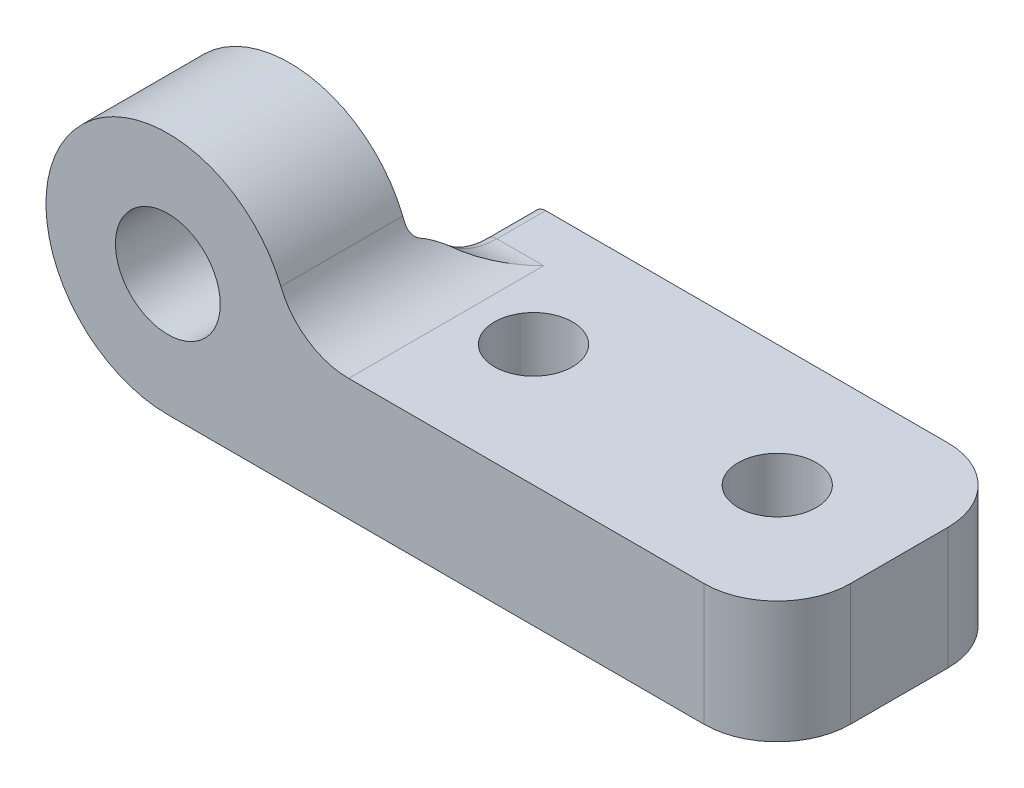
ISO-10303-21;
HEADER;
FILE_DESCRIPTION(('STEP AP214'),'2;1');
FILE_NAME('part.step','',(''),(''),'','','');
FILE_SCHEMA(('AUTOMOTIVE_DESIGN { 1 0 10303 214 1 1 1 1 }'));
ENDSEC;
DATA;
#1=APPLICATION_CONTEXT('core data for automotive mechanical design processes');
#2=APPLICATION_PROTOCOL_DEFINITION('international standard','automotive_design',2000,#1);
#3=PRODUCT_CONTEXT('',#1,'mechanical');
#4=PRODUCT('Part','Part','',(#3));
#5=PRODUCT_RELATED_PRODUCT_CATEGORY('part','',(#4));
#6=PRODUCT_DEFINITION_FORMATION('','',#4);
#7=PRODUCT_DEFINITION_CONTEXT('part definition',#1,'design');
#8=PRODUCT_DEFINITION('design','',#6,#7);
#9=PRODUCT_DEFINITION_SHAPE('','',#8);
#10=(LENGTH_UNIT() NAMED_UNIT(*) SI_UNIT(.MILLI.,.METRE.));
#11=(NAMED_UNIT(*) PLANE_ANGLE_UNIT() SI_UNIT($,.RADIAN.));
#12=(NAMED_UNIT(*) SI_UNIT($,.STERADIAN.) SOLID_ANGLE_UNIT());
#13=UNCERTAINTY_MEASURE_WITH_UNIT(LENGTH_MEASURE(1.E-05),#10,'distance_accuracy_value','');
#14=(GEOMETRIC_REPRESENTATION_CONTEXT(3) GLOBAL_UNCERTAINTY_ASSIGNED_CONTEXT((#13)) GLOBAL_UNIT_ASSIGNED_CONTEXT((#10,
#11,#12)) REPRESENTATION_CONTEXT('',''));
#15=CARTESIAN_POINT('',(0.,0.,0.));
#16=DIRECTION('',(0.,0.,1.));
#17=DIRECTION('',(1.,0.,0.));
#18=AXIS2_PLACEMENT_3D('',#15,#16,#17);
#19=CARTESIAN_POINT('',(0.,0.,5.));
#20=DIRECTION('',(0.,0.,1.));
#21=DIRECTION('',(1.,0.,0.));
#22=AXIS2_PLACEMENT_3D('',#19,#20,#21);
#23=PLANE('',#22);
#24=CARTESIAN_POINT('',(0.,0.,5.));
#25=DIRECTION('',(0.,0.,1.));
#26=DIRECTION('',(1.,0.,0.));
#27=AXIS2_PLACEMENT_3D('',#24,#25,#26);
#28=CIRCLE('',#27,2.15);
#29=CARTESIAN_POINT('',(2.15,0.,5.));
#30=VERTEX_POINT('',#29);
#31=EDGE_CURVE('E170',#30,#30,#28,.T.);
#32=ORIENTED_EDGE('',*,*,#31,.F.);
#33=EDGE_LOOP('',(#32));
#34=FACE_BOUND('',#33,.T.);
#35=DIRECTION('',(1.,0.,0.));
#36=VECTOR('',#35,1.);
#37=CARTESIAN_POINT('',(0.,-5.,5.));
#38=LINE('',#37,#36);
#39=CARTESIAN_POINT('',(0.,-5.,5.));
#40=VERTEX_POINT('',#39);
#41=CARTESIAN_POINT('',(22.,-5.,5.));
#42=VERTEX_POINT('',#41);
#43=EDGE_CURVE('E174',#40,#42,#38,.T.);
#44=ORIENTED_EDGE('',*,*,#43,.T.);
#45=DIRECTION('',(0.,-1.,0.));
#46=VECTOR('',#45,1.);
#47=CARTESIAN_POINT('',(22.,0.,5.));
#48=LINE('',#47,#46);
#49=CARTESIAN_POINT('',(22.,0.,5.));
#50=VERTEX_POINT('',#49);
#51=EDGE_CURVE('E62',#42,#50,#48,.F.);
#52=ORIENTED_EDGE('',*,*,#51,.T.);
#53=DIRECTION('',(1.,0.,0.));
#54=VECTOR('',#53,1.);
#55=CARTESIAN_POINT('',(0.,0.,5.));
#56=LINE('',#55,#54);
#57=CARTESIAN_POINT('',(7.41619848709566,0.,5.));
#58=VERTEX_POINT('',#57);
#59=EDGE_CURVE('E184',#58,#50,#56,.T.);
#60=ORIENTED_EDGE('',*,*,#59,.F.);
#61=CARTESIAN_POINT('',(7.41619848709566,3.,5.));
#62=DIRECTION('',(0.,0.,1.));
#63=DIRECTION('',(1.,0.,0.));
#64=AXIS2_PLACEMENT_3D('',#61,#62,#63);
#65=CIRCLE('',#64,3.);
#66=CARTESIAN_POINT('',(4.63512405443479,1.875,5.));
#67=VERTEX_POINT('',#66);
#68=EDGE_CURVE('E195',#58,#67,#65,.F.);
#69=ORIENTED_EDGE('',*,*,#68,.T.);
#70=CARTESIAN_POINT('',(0.,0.,5.));
#71=DIRECTION('',(0.,0.,1.));
#72=DIRECTION('',(1.,0.,0.));
#73=AXIS2_PLACEMENT_3D('',#70,#71,#72);
#74=CIRCLE('',#73,5.);
#75=EDGE_CURVE('E169',#67,#40,#74,.T.);
#76=ORIENTED_EDGE('',*,*,#75,.T.);
#77=EDGE_LOOP('',(#44,#52,#60,#69,#76));
#78=FACE_BOUND('',#77,.T.);
#79=ADVANCED_FACE('F39',(#34,#78),#23,.T.);
#80=CARTESIAN_POINT('',(0.,0.,0.));
#81=DIRECTION('',(0.,0.,1.));
#82=DIRECTION('',(1.,0.,0.));
#83=AXIS2_PLACEMENT_3D('',#80,#81,#82);
#84=PLANE('',#83);
#85=CARTESIAN_POINT('',(7.41619848709566,3.,0.));
#86=DIRECTION('',(0.,0.,1.));
#87=DIRECTION('',(1.,0.,0.));
#88=AXIS2_PLACEMENT_3D('',#85,#86,#87);
#89=CIRCLE('',#88,3.);
#90=CARTESIAN_POINT('',(4.63512405443479,1.875,0.));
#91=VERTEX_POINT('',#90);
#92=CARTESIAN_POINT('',(4.74291936944649,1.63853800672187,0.));
#93=VERTEX_POINT('',#92);
#94=EDGE_CURVE('E193',#91,#93,#89,.T.);
#95=ORIENTED_EDGE('',*,*,#94,.T.);
#96=CARTESIAN_POINT('',(5.03478250618408,0.190284366446676,-0.618473127065329));
#97=CARTESIAN_POINT('',(5.17924355248974,0.233687536650278,0.));
#98=CARTESIAN_POINT('',(4.56956501236816,0.0505102572168218,0.));
#99=CARTESIAN_POINT('',(5.02257175089872,0.246379258458411,-0.600326381471568));
#100=CARTESIAN_POINT('',(5.14248850087224,0.272052467553295,0.));
#101=CARTESIAN_POINT('',(4.54514350140173,0.131926460099157,0.));
#102=CARTESIAN_POINT('',(5.0138538586825,0.304814689622035,-0.581174993979142));
#103=CARTESIAN_POINT('',(5.10782921733972,0.319464736814677,0.));
#104=CARTESIAN_POINT('',(4.52770771694514,0.215070111300229,0.));
#105=CARTESIAN_POINT('',(5.00259462089896,0.42515232100956,-0.541513315134813));
#106=CARTESIAN_POINT('',(5.04752693229299,0.426619381448087,0.));
#107=CARTESIAN_POINT('',(4.50518924155133,0.38232986351428,0.));
#108=CARTESIAN_POINT('',(5.0000006567291,0.487020277447617,-0.521016167447404));
#109=CARTESIAN_POINT('',(5.02145993490053,0.485666949690905,0.));
#110=CARTESIAN_POINT('',(4.50000131340713,0.466431394269014,0.));
#111=CARTESIAN_POINT('',(4.9999989581471,0.651232487158578,-0.466659380616803));
#112=CARTESIAN_POINT('',(4.96774620965812,0.647968262364999,0.));
#113=CARTESIAN_POINT('',(4.49999791637522,0.683895251161616,0.));
#114=CARTESIAN_POINT('',(5.0065246259501,0.75603694629194,-0.432012517621331));
#115=CARTESIAN_POINT('',(4.94575651634707,0.75898544947662,0.));
#116=CARTESIAN_POINT('',(4.51304925169868,0.817223195875755,0.));
#117=CARTESIAN_POINT('',(5.02959105704785,0.973006744058944,-0.36209086247517));
#118=CARTESIAN_POINT('',(4.92634677959586,0.992139139228018,0.));
#119=CARTESIAN_POINT('',(4.55918211392582,1.08073967425488,0.));
#120=CARTESIAN_POINT('',(5.04618480400655,1.08520820603648,-0.326813713253743));
#121=CARTESIAN_POINT('',(4.92764947028998,1.11426844665437,0.));
#122=CARTESIAN_POINT('',(4.59236960816057,1.21090778404174,0.));
#123=CARTESIAN_POINT('',(5.09007022801355,1.33475606872088,-0.252663773424171));
#124=CARTESIAN_POINT('',(4.9522449434099,1.38090818453704,0.));
#125=CARTESIAN_POINT('',(4.68014045585593,1.48681425086296,0.));
#126=CARTESIAN_POINT('',(5.11864922841737,1.47325239361425,-0.214119424530078));
#127=CARTESIAN_POINT('',(4.97788581721399,1.52790190919719,0.));
#128=CARTESIAN_POINT('',(4.73729845586683,1.63170934224265,0.));
#129=CARTESIAN_POINT('',(5.18261429560836,1.75882923292263,-0.14362154746534));
#130=CARTESIAN_POINT('',(5.04859606392434,1.82110509321211,0.));
#131=CARTESIAN_POINT('',(4.86522859020357,1.91544478185198,0.));
#132=CARTESIAN_POINT('',(5.21801294800704,1.90592526289275,-0.111680435026558));
#133=CARTESIAN_POINT('',(5.09327366657072,1.96890779920535,0.));
#134=CARTESIAN_POINT('',(4.93602589575534,2.05427334401096,0.));
#135=CARTESIAN_POINT('',(5.29306008732954,2.20722328665073,-0.0583799571947826));
#136=CARTESIAN_POINT('',(5.19457888326569,2.26179791760295,0.));
#137=CARTESIAN_POINT('',(5.08612017491822,2.32748395615759,0.));
#138=CARTESIAN_POINT('',(5.33271637963534,2.36143802551267,-0.037040444524281));
#139=CARTESIAN_POINT('',(5.25153079383402,2.40881518356096,0.));
#140=CARTESIAN_POINT('',(5.16543275929145,2.46185722743059,0.));
#141=CARTESIAN_POINT('',(5.41401865001419,2.67370467487119,-0.00801623075713629));
#142=CARTESIAN_POINT('',(5.37060624432504,2.69974739914806,0.));
#143=CARTESIAN_POINT('',(5.32803729991853,2.72801138084455,0.));
#144=CARTESIAN_POINT('',(5.45566348076545,2.83175434745127,-0.000323751230628065));
#145=CARTESIAN_POINT('',(5.43348646360943,2.84575093606398,0.));
#146=CARTESIAN_POINT('',(5.41132696152862,2.8597936973689,0.));
#147=CARTESIAN_POINT('',(5.49821825923777,2.99323876029808,-3.29128078525582E-06));
#148=CARTESIAN_POINT('',(5.49732737620623,2.99380218933209,0.));
#149=CARTESIAN_POINT('',(5.49643651847559,2.9943656388517,0.));
#150=CARTESIAN_POINT('',(5.49910913007641,2.99661937709075,4.38688642673777E-08));
#151=CARTESIAN_POINT('',(5.49866368657529,2.99690109845423,0.));
#152=CARTESIAN_POINT('',(5.49821826015288,2.99718281971953,0.));
#153=CARTESIAN_POINT('',(5.5,3.,0.));
#154=CARTESIAN_POINT('',(5.5,3.,0.));
#155=CARTESIAN_POINT('',(5.5,3.,0.));
#156=(BOUNDED_SURFACE() B_SPLINE_SURFACE(3,2,((#96,#97,#98),(#99,#100,#101),(#102,#103,#104),
(#105,#106,#107),(#108,#109,#110),(#111,#112,#113),(#114,#115,#116),(#117,#118,#119),(#120,#121,
#122),(#123,#124,#125),(#126,#127,#128),(#129,#130,#131),(#132,#133,#134),(#135,#136,#137),
(#138,#139,#140),(#141,#142,#143),(#144,#145,#146),(#147,#148,#149),(#150,#151,#152),(#153,#154,
#155)),.UNSPECIFIED.,.F.,.F.,.F.) B_SPLINE_SURFACE_WITH_KNOTS((4,2,2,2,2,2,2,2,2,4),(3,3),(0.,
0.254174347496883,0.506156676722879,0.905908294187887,1.30778209054064,1.77398960052862,
2.2410658803955,2.70901354847842,3.17669441359253,3.18669441359307),(0.,1.),
.UNSPECIFIED.) GEOMETRIC_REPRESENTATION_ITEM() RATIONAL_B_SPLINE_SURFACE(((1.,0.617678616219367,
1.),(1.,0.632385474459163,1.),(1.,0.647345517953677,1.),(1.,0.67727649991279,1.),(1.,
0.692246231770443,1.),(1.,0.730681960778521,1.),(1.,0.753982355327923,1.),(1.,0.79901258307502,
1.),(1.,0.820733421895581,1.),(1.,0.864809657092309,1.),(1.,0.886709996156685,1.),(1.,
0.925613944869766,1.),(1.,0.942608353494843,1.),(1.,0.970472728603621,1.),(1.,0.981331210037782,
1.),(1.,0.996012120267791,1.),(1.,0.999838557178386,1.),(1.,0.999998345092795,1.),(1.,
1.00000001226919,1.),(1.,1.,1.))) REPRESENTATION_ITEM('') SURFACE());
#157=CARTESIAN_POINT('',(5.5,3.,0.));
#158=CARTESIAN_POINT('',(5.49821826015288,2.99718281971953,0.));
#159=CARTESIAN_POINT('',(5.49643651847559,2.9943656388517,0.));
#160=CARTESIAN_POINT('',(5.41132696152863,2.8597936973689,0.));
#161=CARTESIAN_POINT('',(5.32803729991853,2.72801138084455,0.));
#162=CARTESIAN_POINT('',(5.16543275929145,2.46185722743059,0.));
#163=CARTESIAN_POINT('',(5.08612017491822,2.32748395615759,0.));
#164=CARTESIAN_POINT('',(4.93602589575534,2.05427334401096,0.));
#165=CARTESIAN_POINT('',(4.86522859020357,1.91544478185198,0.));
#166=CARTESIAN_POINT('',(4.73729845586683,1.63170934224265,0.));
#167=CARTESIAN_POINT('',(4.68014045585593,1.48681425086296,0.));
#168=CARTESIAN_POINT('',(4.59236960816057,1.21090778404174,0.));
#169=CARTESIAN_POINT('',(4.55918211392583,1.08073967425488,0.));
#170=CARTESIAN_POINT('',(4.51304925169868,0.817223195875755,0.));
#171=CARTESIAN_POINT('',(4.49999791637522,0.683895251161616,0.));
#172=CARTESIAN_POINT('',(4.50000131340713,0.466431394269014,0.));
#173=CARTESIAN_POINT('',(4.50518924155133,0.38232986351428,0.));
#174=CARTESIAN_POINT('',(4.52770771694514,0.215070111300229,0.));
#175=CARTESIAN_POINT('',(4.54514350140173,0.131926460099157,0.));
#176=CARTESIAN_POINT('',(4.56956501236816,0.0505102572168218,0.));
#177=B_SPLINE_CURVE_WITH_KNOTS('',3,(#157,#158,#159,#160,#161,#162,#163,#164,#165,#166,#167,
#168,#169,#170,#171,#172,#173,#174,#175,#176),.UNSPECIFIED.,.F.,.F.,(4,2,2,2,2,2,2,2,2,4),(0.,
0.0100000000005313,0.477680865114649,0.945628533197563,1.41270481306445,1.87891232305242,
2.28078611940518,2.68053773687019,2.93252006609618,3.18669441359307),.UNSPECIFIED.);
#178=CARTESIAN_POINT('',(4.5,0.550510257216822,0.));
#179=VERTEX_POINT('',#178);
#180=EDGE_CURVE('E376',#93,#179,#177,.T.);
#181=ORIENTED_EDGE('',*,*,#180,.T.);
#182=DIRECTION('',(0.,-1.,0.));
#183=VECTOR('',#182,1.);
#184=CARTESIAN_POINT('',(4.5,0.,0.));
#185=LINE('',#184,#183);
#186=CARTESIAN_POINT('',(4.5,-4.5,0.));
#187=VERTEX_POINT('',#186);
#188=EDGE_CURVE('E416',#179,#187,#185,.T.);
#189=ORIENTED_EDGE('',*,*,#188,.T.);
#190=CARTESIAN_POINT('',(5.5,-4.5,0.));
#191=DIRECTION('',(0.,0.,1.));
#192=DIRECTION('',(1.,0.,0.));
#193=AXIS2_PLACEMENT_3D('',#190,#191,#192);
#194=CIRCLE('',#193,1.);
#195=CARTESIAN_POINT('',(4.63397459621556,-5.,0.));
#196=VERTEX_POINT('',#195);
#197=EDGE_CURVE('E154',#187,#196,#194,.T.);
#198=ORIENTED_EDGE('',*,*,#197,.T.);
#199=DIRECTION('',(-1.,0.,0.));
#200=VECTOR('',#199,1.);
#201=CARTESIAN_POINT('',(0.,-5.,0.));
#202=LINE('',#201,#200);
#203=CARTESIAN_POINT('',(0.,-5.,0.));
#204=VERTEX_POINT('',#203);
#205=EDGE_CURVE('E147',#196,#204,#202,.T.);
#206=ORIENTED_EDGE('',*,*,#205,.T.);
#207=CARTESIAN_POINT('',(0.,0.,0.));
#208=DIRECTION('',(0.,0.,1.));
#209=DIRECTION('',(1.,0.,0.));
#210=AXIS2_PLACEMENT_3D('',#207,#208,#209);
#211=CIRCLE('',#210,5.);
#212=EDGE_CURVE('E152',#91,#204,#211,.T.);
#213=ORIENTED_EDGE('',*,*,#212,.F.);
#214=EDGE_LOOP('',(#95,#181,#189,#198,#206,#213));
#215=FACE_BOUND('',#214,.T.);
#216=CARTESIAN_POINT('',(0.,0.,0.));
#217=DIRECTION('',(0.,0.,1.));
#218=DIRECTION('',(1.,0.,0.));
#219=AXIS2_PLACEMENT_3D('',#216,#217,#218);
#220=CIRCLE('',#219,2.15);
#221=CARTESIAN_POINT('',(2.15,0.,0.));
#222=VERTEX_POINT('',#221);
#223=EDGE_CURVE('E183',#222,#222,#220,.T.);
#224=ORIENTED_EDGE('',*,*,#223,.T.);
#225=EDGE_LOOP('',(#224));
#226=FACE_BOUND('',#225,.T.);
#227=ADVANCED_FACE('F150',(#215,#226),#84,.F.);
#228=CARTESIAN_POINT('',(0.,0.,5.));
#229=DIRECTION('',(0.,0.,-1.));
#230=DIRECTION('',(-1.,0.,0.));
#231=AXIS2_PLACEMENT_3D('',#228,#229,#230);
#232=CYLINDRICAL_SURFACE('',#231,5.);
#233=ORIENTED_EDGE('',*,*,#75,.F.);
#234=DIRECTION('',(0.,0.,-1.));
#235=VECTOR('',#234,1.);
#236=CARTESIAN_POINT('',(4.63512405443479,1.875,5.));
#237=LINE('',#236,#235);
#238=EDGE_CURVE('E168',#67,#91,#237,.T.);
#239=ORIENTED_EDGE('',*,*,#238,.T.);
#240=ORIENTED_EDGE('',*,*,#212,.T.);
#241=DIRECTION('',(0.,0.,-1.));
#242=VECTOR('',#241,1.);
#243=CARTESIAN_POINT('',(0.,-5.,0.));
#244=LINE('',#243,#242);
#245=EDGE_CURVE('E158',#40,#204,#244,.T.);
#246=ORIENTED_EDGE('',*,*,#245,.F.);
#247=EDGE_LOOP('',(#233,#239,#240,#246));
#248=FACE_BOUND('',#247,.T.);
#249=ADVANCED_FACE('F165',(#248),#232,.T.);
#250=CARTESIAN_POINT('',(0.,0.,5.));
#251=DIRECTION('',(0.,0.,-1.));
#252=DIRECTION('',(-1.,0.,0.));
#253=AXIS2_PLACEMENT_3D('',#250,#251,#252);
#254=CYLINDRICAL_SURFACE('',#253,2.15);
#255=ORIENTED_EDGE('',*,*,#223,.F.);
#256=EDGE_LOOP('',(#255));
#257=FACE_BOUND('',#256,.T.);
#258=ORIENTED_EDGE('',*,*,#31,.T.);
#259=EDGE_LOOP('',(#258));
#260=FACE_BOUND('',#259,.T.);
#261=ADVANCED_FACE('F306',(#257,#260),#254,.F.);
#262=CARTESIAN_POINT('',(0.,0.,0.));
#263=DIRECTION('',(0.,1.,0.));
#264=DIRECTION('',(0.,0.,1.));
#265=AXIS2_PLACEMENT_3D('',#262,#263,#264);
#266=PLANE('',#265);
#267=CARTESIAN_POINT('',(20.,0.,0.));
#268=DIRECTION('',(0.,1.,0.));
#269=DIRECTION('',(0.,0.,1.));
#270=AXIS2_PLACEMENT_3D('',#267,#268,#269);
#271=CIRCLE('',#270,1.6);
#272=CARTESIAN_POINT('',(20.,0.,1.6));
#273=VERTEX_POINT('',#272);
#274=EDGE_CURVE('E176',#273,#273,#271,.T.);
#275=ORIENTED_EDGE('',*,*,#274,.F.);
#276=EDGE_LOOP('',(#275));
#277=FACE_BOUND('',#276,.T.);
#278=CARTESIAN_POINT('',(10.,0.,0.));
#279=DIRECTION('',(0.,1.,0.));
#280=DIRECTION('',(0.,0.,1.));
#281=AXIS2_PLACEMENT_3D('',#278,#279,#280);
#282=CIRCLE('',#281,1.6);
#283=CARTESIAN_POINT('',(10.,0.,1.6));
#284=VERTEX_POINT('',#283);
#285=EDGE_CURVE('E343',#284,#284,#282,.T.);
#286=ORIENTED_EDGE('',*,*,#285,.F.);
#287=EDGE_LOOP('',(#286));
#288=FACE_BOUND('',#287,.T.);
#289=ORIENTED_EDGE('',*,*,#59,.T.);
#290=CARTESIAN_POINT('',(22.,0.,2.));
#291=DIRECTION('',(0.,1.,0.));
#292=DIRECTION('',(0.,0.,1.));
#293=AXIS2_PLACEMENT_3D('',#290,#291,#292);
#294=CIRCLE('',#293,3.);
#295=CARTESIAN_POINT('',(25.,0.,2.));
#296=VERTEX_POINT('',#295);
#297=EDGE_CURVE('E47',#50,#296,#294,.T.);
#298=ORIENTED_EDGE('',*,*,#297,.T.);
#299=DIRECTION('',(0.,0.,-1.));
#300=VECTOR('',#299,1.);
#301=CARTESIAN_POINT('',(25.,0.,0.));
#302=LINE('',#301,#300);
#303=CARTESIAN_POINT('',(25.,0.,-2.));
#304=VERTEX_POINT('',#303);
#305=EDGE_CURVE('E430',#296,#304,#302,.T.);
#306=ORIENTED_EDGE('',*,*,#305,.T.);
#307=CARTESIAN_POINT('',(22.,0.,-2.));
#308=DIRECTION('',(0.,1.,0.));
#309=DIRECTION('',(0.,0.,1.));
#310=AXIS2_PLACEMENT_3D('',#307,#308,#309);
#311=CIRCLE('',#310,3.);
#312=CARTESIAN_POINT('',(22.,0.,-5.));
#313=VERTEX_POINT('',#312);
#314=EDGE_CURVE('E54',#304,#313,#311,.T.);
#315=ORIENTED_EDGE('',*,*,#314,.T.);
#316=DIRECTION('',(1.,0.,0.));
#317=VECTOR('',#316,1.);
#318=CARTESIAN_POINT('',(0.,0.,-5.));
#319=LINE('',#318,#317);
#320=CARTESIAN_POINT('',(5.5,0.,-5.));
#321=VERTEX_POINT('',#320);
#322=EDGE_CURVE('E347',#321,#313,#319,.T.);
#323=ORIENTED_EDGE('',*,*,#322,.F.);
#324=DIRECTION('',(0.,0.,-1.));
#325=VECTOR('',#324,1.);
#326=CARTESIAN_POINT('',(5.5,0.,0.));
#327=LINE('',#326,#325);
#328=CARTESIAN_POINT('',(5.5,0.,-3.));
#329=VERTEX_POINT('',#328);
#330=EDGE_CURVE('E209',#321,#329,#327,.F.);
#331=ORIENTED_EDGE('',*,*,#330,.T.);
#332=DIRECTION('',(1.,0.,0.));
#333=VECTOR('',#332,1.);
#334=CARTESIAN_POINT('',(0.,0.,-3.));
#335=LINE('',#334,#333);
#336=CARTESIAN_POINT('',(7.41619848709566,0.,-3.));
#337=VERTEX_POINT('',#336);
#338=EDGE_CURVE('E197',#329,#337,#335,.T.);
#339=ORIENTED_EDGE('',*,*,#338,.T.);
#340=DIRECTION('',(0.,0.,-1.));
#341=VECTOR('',#340,1.);
#342=CARTESIAN_POINT('',(7.41619848709566,0.,0.));
#343=LINE('',#342,#341);
#344=EDGE_CURVE('E191',#337,#58,#343,.F.);
#345=ORIENTED_EDGE('',*,*,#344,.T.);
#346=EDGE_LOOP('',(#289,#298,#306,#315,#323,#331,#339,#345));
#347=FACE_BOUND('',#346,.T.);
#348=ADVANCED_FACE('F309',(#277,#288,#347),#266,.T.);
#349=CARTESIAN_POINT('',(25.,0.,0.));
#350=DIRECTION('',(-1.,0.,0.));
#351=DIRECTION('',(0.,0.,1.));
#352=AXIS2_PLACEMENT_3D('',#349,#350,#351);
#353=PLANE('',#352);
#354=ORIENTED_EDGE('',*,*,#305,.F.);
#355=DIRECTION('',(0.,-1.,0.));
#356=VECTOR('',#355,1.);
#357=CARTESIAN_POINT('',(25.,-5.,2.));
#358=LINE('',#357,#356);
#359=CARTESIAN_POINT('',(25.,-5.,2.));
#360=VERTEX_POINT('',#359);
#361=EDGE_CURVE('E351',#296,#360,#358,.T.);
#362=ORIENTED_EDGE('',*,*,#361,.T.);
#363=DIRECTION('',(0.,0.,-1.));
#364=VECTOR('',#363,1.);
#365=CARTESIAN_POINT('',(25.,-5.,0.));
#366=LINE('',#365,#364);
#367=CARTESIAN_POINT('',(25.,-5.,-2.));
#368=VERTEX_POINT('',#367);
#369=EDGE_CURVE('E424',#360,#368,#366,.T.);
#370=ORIENTED_EDGE('',*,*,#369,.T.);
#371=DIRECTION('',(0.,-1.,0.));
#372=VECTOR('',#371,1.);
#373=CARTESIAN_POINT('',(25.,0.,-2.));
#374=LINE('',#373,#372);
#375=EDGE_CURVE('E359',#368,#304,#374,.F.);
#376=ORIENTED_EDGE('',*,*,#375,.T.);
#377=EDGE_LOOP('',(#354,#362,#370,#376));
#378=FACE_BOUND('',#377,.T.);
#379=ADVANCED_FACE('F320',(#378),#353,.F.);
#380=CARTESIAN_POINT('',(0.,0.,-5.));
#381=DIRECTION('',(0.,0.,-1.));
#382=DIRECTION('',(-1.,0.,0.));
#383=AXIS2_PLACEMENT_3D('',#380,#381,#382);
#384=PLANE('',#383);
#385=ORIENTED_EDGE('',*,*,#322,.T.);
#386=DIRECTION('',(0.,-1.,0.));
#387=VECTOR('',#386,1.);
#388=CARTESIAN_POINT('',(22.,-5.,-5.));
#389=LINE('',#388,#387);
#390=CARTESIAN_POINT('',(22.,-5.,-5.));
#391=VERTEX_POINT('',#390);
#392=EDGE_CURVE('E11',#313,#391,#389,.T.);
#393=ORIENTED_EDGE('',*,*,#392,.T.);
#394=DIRECTION('',(1.,0.,0.));
#395=VECTOR('',#394,1.);
#396=CARTESIAN_POINT('',(0.,-5.,-5.));
#397=LINE('',#396,#395);
#398=CARTESIAN_POINT('',(5.5,-5.,-5.));
#399=VERTEX_POINT('',#398);
#400=EDGE_CURVE('E159',#399,#391,#397,.T.);
#401=ORIENTED_EDGE('',*,*,#400,.F.);
#402=CARTESIAN_POINT('',(5.5,-4.5,-5.));
#403=DIRECTION('',(0.,0.,-1.));
#404=DIRECTION('',(-1.,0.,0.));
#405=AXIS2_PLACEMENT_3D('',#402,#403,#404);
#406=CIRCLE('',#405,0.5);
#407=CARTESIAN_POINT('',(5.,-4.5,-5.));
#408=VERTEX_POINT('',#407);
#409=EDGE_CURVE('E370',#399,#408,#406,.T.);
#410=ORIENTED_EDGE('',*,*,#409,.T.);
#411=DIRECTION('',(0.,-1.,0.));
#412=VECTOR('',#411,1.);
#413=CARTESIAN_POINT('',(5.,0.,-5.));
#414=LINE('',#413,#412);
#415=CARTESIAN_POINT('',(5.,-0.5,-5.));
#416=VERTEX_POINT('',#415);
#417=EDGE_CURVE('E180',#416,#408,#414,.T.);
#418=ORIENTED_EDGE('',*,*,#417,.F.);
#419=CARTESIAN_POINT('',(5.5,-0.5,-5.));
#420=DIRECTION('',(0.,0.,-1.));
#421=DIRECTION('',(-1.,0.,0.));
#422=AXIS2_PLACEMENT_3D('',#419,#420,#421);
#423=CIRCLE('',#422,0.5);
#424=EDGE_CURVE('E207',#416,#321,#423,.T.);
#425=ORIENTED_EDGE('',*,*,#424,.T.);
#426=EDGE_LOOP('',(#385,#393,#401,#410,#418,#425));
#427=FACE_BOUND('',#426,.T.);
#428=ADVANCED_FACE('F323',(#427),#384,.T.);
#429=CARTESIAN_POINT('',(5.,0.,0.));
#430=DIRECTION('',(-1.,0.,0.));
#431=DIRECTION('',(0.,0.,1.));
#432=AXIS2_PLACEMENT_3D('',#429,#430,#431);
#433=PLANE('',#432);
#434=DIRECTION('',(0.,0.,-1.));
#435=VECTOR('',#434,1.);
#436=CARTESIAN_POINT('',(5.,-4.5,0.));
#437=LINE('',#436,#435);
#438=CARTESIAN_POINT('',(5.,-4.5,-0.5));
#439=VERTEX_POINT('',#438);
#440=EDGE_CURVE('E417',#408,#439,#437,.F.);
#441=ORIENTED_EDGE('',*,*,#440,.T.);
#442=DIRECTION('',(0.,-1.,0.));
#443=VECTOR('',#442,1.);
#444=CARTESIAN_POINT('',(5.,0.,-0.5));
#445=LINE('',#444,#443);
#446=CARTESIAN_POINT('',(5.,0.550510257216822,-0.5));
#447=VERTEX_POINT('',#446);
#448=EDGE_CURVE('E248',#439,#447,#445,.F.);
#449=ORIENTED_EDGE('',*,*,#448,.T.);
#450=CARTESIAN_POINT('',(5.,3.,-3.));
#451=DIRECTION('',(-1.,0.,0.));
#452=DIRECTION('',(0.,0.,1.));
#453=AXIS2_PLACEMENT_3D('',#450,#451,#452);
#454=CIRCLE('',#453,3.5);
#455=CARTESIAN_POINT('',(5.,-0.5,-3.));
#456=VERTEX_POINT('',#455);
#457=EDGE_CURVE('E202',#447,#456,#454,.F.);
#458=ORIENTED_EDGE('',*,*,#457,.T.);
#459=DIRECTION('',(0.,0.,-1.));
#460=VECTOR('',#459,1.);
#461=CARTESIAN_POINT('',(5.,-0.5,0.));
#462=LINE('',#461,#460);
#463=EDGE_CURVE('E204',#456,#416,#462,.T.);
#464=ORIENTED_EDGE('',*,*,#463,.T.);
#465=ORIENTED_EDGE('',*,*,#417,.T.);
#466=EDGE_LOOP('',(#441,#449,#458,#464,#465));
#467=FACE_BOUND('',#466,.T.);
#468=ADVANCED_FACE('F318',(#467),#433,.T.);
#469=CARTESIAN_POINT('',(10.,0.,0.));
#470=DIRECTION('',(0.,-1.,0.));
#471=DIRECTION('',(0.,0.,-1.));
#472=AXIS2_PLACEMENT_3D('',#469,#470,#471);
#473=CYLINDRICAL_SURFACE('',#472,1.6);
#474=ORIENTED_EDGE('',*,*,#285,.T.);
#475=EDGE_LOOP('',(#474));
#476=FACE_BOUND('',#475,.T.);
#477=CARTESIAN_POINT('',(10.,-5.,0.));
#478=DIRECTION('',(0.,1.,0.));
#479=DIRECTION('',(0.,0.,1.));
#480=AXIS2_PLACEMENT_3D('',#477,#478,#479);
#481=CIRCLE('',#480,1.6);
#482=CARTESIAN_POINT('',(10.,-5.,1.6));
#483=VERTEX_POINT('',#482);
#484=EDGE_CURVE('E409',#483,#483,#481,.T.);
#485=ORIENTED_EDGE('',*,*,#484,.F.);
#486=EDGE_LOOP('',(#485));
#487=FACE_BOUND('',#486,.T.);
#488=ADVANCED_FACE('F314',(#476,#487),#473,.F.);
#489=CARTESIAN_POINT('',(20.,0.,0.));
#490=DIRECTION('',(0.,-1.,0.));
#491=DIRECTION('',(0.,0.,-1.));
#492=AXIS2_PLACEMENT_3D('',#489,#490,#491);
#493=CYLINDRICAL_SURFACE('',#492,1.6);
#494=ORIENTED_EDGE('',*,*,#274,.T.);
#495=EDGE_LOOP('',(#494));
#496=FACE_BOUND('',#495,.T.);
#497=CARTESIAN_POINT('',(20.,-5.,0.));
#498=DIRECTION('',(0.,1.,0.));
#499=DIRECTION('',(0.,0.,1.));
#500=AXIS2_PLACEMENT_3D('',#497,#498,#499);
#501=CIRCLE('',#500,1.6);
#502=CARTESIAN_POINT('',(20.,-5.,1.6));
#503=VERTEX_POINT('',#502);
#504=EDGE_CURVE('E407',#503,#503,#501,.T.);
#505=ORIENTED_EDGE('',*,*,#504,.F.);
#506=EDGE_LOOP('',(#505));
#507=FACE_BOUND('',#506,.T.);
#508=ADVANCED_FACE('F311',(#496,#507),#493,.F.);
#509=CARTESIAN_POINT('',(0.,-5.,0.));
#510=DIRECTION('',(0.,1.,0.));
#511=DIRECTION('',(0.,0.,1.));
#512=AXIS2_PLACEMENT_3D('',#509,#510,#511);
#513=PLANE('',#512);
#514=ORIENTED_EDGE('',*,*,#504,.T.);
#515=EDGE_LOOP('',(#514));
#516=FACE_BOUND('',#515,.T.);
#517=ORIENTED_EDGE('',*,*,#484,.T.);
#518=EDGE_LOOP('',(#517));
#519=FACE_BOUND('',#518,.T.);
#520=ORIENTED_EDGE('',*,*,#369,.F.);
#521=CARTESIAN_POINT('',(22.,-5.,2.));
#522=DIRECTION('',(0.,1.,0.));
#523=DIRECTION('',(0.,0.,1.));
#524=AXIS2_PLACEMENT_3D('',#521,#522,#523);
#525=CIRCLE('',#524,3.);
#526=EDGE_CURVE('E355',#360,#42,#525,.F.);
#527=ORIENTED_EDGE('',*,*,#526,.T.);
#528=ORIENTED_EDGE('',*,*,#43,.F.);
#529=ORIENTED_EDGE('',*,*,#245,.T.);
#530=ORIENTED_EDGE('',*,*,#205,.F.);
#531=CARTESIAN_POINT('',(4.63397459621556,-5.,0.));
#532=CARTESIAN_POINT('',(4.67688673213991,-5.,2.48767622453274E-05));
#533=CARTESIAN_POINT('',(4.71959051081449,-5.,-0.00413110124984184));
#534=CARTESIAN_POINT('',(4.80319307981018,-5.,-0.0195055748153629));
#535=CARTESIAN_POINT('',(4.84410761309868,-5.,-0.030636551129281));
#536=CARTESIAN_POINT('',(4.93867930565034,-5.,-0.0639472570540699));
#537=CARTESIAN_POINT('',(4.99141160361635,-5.,-0.0886972738753221));
#538=CARTESIAN_POINT('',(5.09254530783112,-5.,-0.146153386522305));
#539=CARTESIAN_POINT('',(5.14092086611907,-5.,-0.178903168599043));
#540=CARTESIAN_POINT('',(5.24296705575193,-5.,-0.256577874954869));
#541=CARTESIAN_POINT('',(5.29575550833484,-5.,-0.30262742467985));
#542=CARTESIAN_POINT('',(5.3979854004391,-5.,-0.398055265960238));
#543=CARTESIAN_POINT('',(5.44742944605679,-5.,-0.447430904383955));
#544=CARTESIAN_POINT('',(5.4978918154322,-5.,-0.497891816548645));
#545=CARTESIAN_POINT('',(5.49894590801891,-5.,-0.498945909183022));
#546=CARTESIAN_POINT('',(5.5,-5.,-0.5));
#547=B_SPLINE_CURVE_WITH_KNOTS('',3,(#531,#532,#533,#534,#535,#536,#537,#538,#539,#540,#541,
#542,#543,#544,#545,#546),.UNSPECIFIED.,.F.,.F.,(4,2,2,2,2,2,2,4),(0.,0.128226141933814,
0.254874717257875,0.428659462723045,0.603415329095683,0.813198981299188,1.02281723215206,
1.02728936811351),.UNSPECIFIED.);
#548=CARTESIAN_POINT('',(5.5,-5.,-0.5));
#549=VERTEX_POINT('',#548);
#550=EDGE_CURVE('E247',#196,#549,#547,.T.);
#551=ORIENTED_EDGE('',*,*,#550,.T.);
#552=DIRECTION('',(0.,0.,-1.));
#553=VECTOR('',#552,1.);
#554=CARTESIAN_POINT('',(5.5,-5.,-5.));
#555=LINE('',#554,#553);
#556=EDGE_CURVE('E222',#549,#399,#555,.T.);
#557=ORIENTED_EDGE('',*,*,#556,.T.);
#558=ORIENTED_EDGE('',*,*,#400,.T.);
#559=CARTESIAN_POINT('',(22.,-5.,-2.));
#560=DIRECTION('',(0.,1.,0.));
#561=DIRECTION('',(0.,0.,1.));
#562=AXIS2_PLACEMENT_3D('',#559,#560,#561);
#563=CIRCLE('',#562,3.);
#564=EDGE_CURVE('E357',#391,#368,#563,.F.);
#565=ORIENTED_EDGE('',*,*,#564,.T.);
#566=EDGE_LOOP('',(#520,#527,#528,#529,#530,#551,#557,#558,#565));
#567=FACE_BOUND('',#566,.T.);
#568=ADVANCED_FACE('F173',(#516,#519,#567),#513,.F.);
#569=CARTESIAN_POINT('',(7.41619848709566,3.,5.));
#570=DIRECTION('',(0.,0.,-1.));
#571=DIRECTION('',(-1.,0.,0.));
#572=AXIS2_PLACEMENT_3D('',#569,#570,#571);
#573=CYLINDRICAL_SURFACE('',#572,3.);
#574=CARTESIAN_POINT('',(5.5,0.691714194894339,-1.08380151290434));
#575=CARTESIAN_POINT('',(5.48254757558459,0.706206582383212,-1.06630381599555));
#576=CARTESIAN_POINT('',(5.46570800276246,0.720515851873281,-1.04808002910448));
#577=CARTESIAN_POINT('',(5.43309934033459,0.74882496821084,-1.01050504287777));
#578=CARTESIAN_POINT('',(5.41732929291377,0.762825084134822,-0.991154881922621));
#579=CARTESIAN_POINT('',(5.38669144048479,0.79058241512817,-0.951642303845773));
#580=CARTESIAN_POINT('',(5.37182259516317,0.804339896750666,-0.931480869774895));
#581=CARTESIAN_POINT('',(5.34286306975693,0.831664963660539,-0.890473395587211));
#582=CARTESIAN_POINT('',(5.3287726041117,0.845232495856893,-0.869627169311342));
#583=CARTESIAN_POINT('',(5.28672846505384,0.886488358759062,-0.804956492569156));
#584=CARTESIAN_POINT('',(5.2599177927029,0.913894810655486,-0.760205835421675));
#585=CARTESIAN_POINT('',(5.20900985168136,0.967836693463207,-0.66866125060925));
#586=CARTESIAN_POINT('',(5.18491339220609,0.994371862955096,-0.621866719338809));
#587=CARTESIAN_POINT('',(5.15031126150248,1.03376416716846,-0.548793093194638));
#588=CARTESIAN_POINT('',(5.13877103026873,1.04715084294512,-0.52328673020789));
#589=CARTESIAN_POINT('',(5.11655905506512,1.07335708992805,-0.471621164722861));
#590=CARTESIAN_POINT('',(5.10588702271846,1.08617684878766,-0.445462182798847));
#591=CARTESIAN_POINT('',(5.08564162023946,1.11088466000649,-0.392703338380404));
#592=CARTESIAN_POINT('',(5.07605693015354,1.12278180370464,-0.366112124218914));
#593=CARTESIAN_POINT('',(5.05802348784173,1.14548648845382,-0.312065226617234));
#594=CARTESIAN_POINT('',(5.0495752076471,1.15629357626431,-0.284609189763219));
#595=CARTESIAN_POINT('',(5.03627735711848,1.17351184694447,-0.236501469372312));
#596=CARTESIAN_POINT('',(5.03108099938676,1.18030879499887,-0.216085748215549));
#597=CARTESIAN_POINT('',(5.02162604585442,1.19276906661542,-0.174733298231354));
#598=CARTESIAN_POINT('',(5.01736584092672,1.19843433384298,-0.153797533361915));
#599=CARTESIAN_POINT('',(5.00996248046667,1.20833379627852,-0.111047374359078));
#600=CARTESIAN_POINT('',(5.00683592052432,1.21254668934524,-0.0892247542067151));
#601=CARTESIAN_POINT('',(5.0021783977626,1.21884297449953,-0.0449913147006417));
#602=CARTESIAN_POINT('',(5.0006567600094,1.22091391991319,-0.0225778250134967));
#603=CARTESIAN_POINT('',(5.00015597930603,1.22159099176993,0.));
#604=B_SPLINE_CURVE_WITH_KNOTS('',3,(#574,#575,#576,#577,#578,#579,#580,#581,#582,#583,#584,
#585,#586,#587,#588,#589,#590,#591,#592,#593,#594,#595,#596,#597,#598,#599,#600,#601,#602,#603),
.UNSPECIFIED.,.F.,.F.,(4,2,2,2,2,2,2,2,2,2,2,2,2,2,4),(0.,0.0858992719005226,0.17172057204849,
0.257440838618485,0.343184604077563,0.519848641303859,0.69656520920743,0.78964100997134,
0.882685767813544,0.974649948934692,1.06665221208779,1.13301643280098,1.19926567377088,
1.26644893383893,1.33402043333435),.UNSPECIFIED.);
#605=CARTESIAN_POINT('',(5.5,0.691714194894339,-1.08380151290434));
#606=VERTEX_POINT('',#605);
#607=CARTESIAN_POINT('',(5.0572142619148,1.14657251953364,-0.30872030453938));
#608=VERTEX_POINT('',#607);
#609=EDGE_CURVE('E213',#606,#608,#604,.T.);
#610=ORIENTED_EDGE('',*,*,#609,.T.);
#611=CARTESIAN_POINT('',(5.05721426191488,1.14657251953354,-0.308720304539303));
#612=CARTESIAN_POINT('',(5.04913102004905,1.15685664243017,-0.282878274250334));
#613=CARTESIAN_POINT('',(5.03958311747499,1.16914925826071,-0.258407572587574));
#614=CARTESIAN_POINT('',(5.01835313006936,1.19704765512781,-0.212721255504547));
#615=CARTESIAN_POINT('',(5.0066866584854,1.21262932491483,-0.191483789132117));
#616=CARTESIAN_POINT('',(4.98192723499263,1.2464999532006,-0.152475181988435));
#617=CARTESIAN_POINT('',(4.96883993043229,1.2647782903597,-0.134691048839208));
#618=CARTESIAN_POINT('',(4.94178466669984,1.30358118749426,-0.102511493134481));
#619=CARTESIAN_POINT('',(4.92781514691114,1.32410977812611,-0.0881223018141294));
#620=CARTESIAN_POINT('',(4.89742575153896,1.37007685955207,-0.060852755264717));
#621=CARTESIAN_POINT('',(4.88094819726811,1.39579305578828,-0.0485074031663133));
#622=CARTESIAN_POINT('',(4.84809688316354,1.44892574433946,-0.0280796781945628));
#623=CARTESIAN_POINT('',(4.83172317801868,1.47634306185568,-0.0199993926295766));
#624=CARTESIAN_POINT('',(4.80306393415222,1.52617428441485,-0.00922498847358002));
#625=CARTESIAN_POINT('',(4.79067166732402,1.54836153159109,-0.00573689258553917));
#626=CARTESIAN_POINT('',(4.76639357318762,1.59316421296674,-0.00113008749633528));
#627=CARTESIAN_POINT('',(4.7545062774205,1.61577808334323,-3.97050302310546E-06));
#628=CARTESIAN_POINT('',(4.74291936944649,1.63853800672187,0.));
#629=B_SPLINE_CURVE_WITH_KNOTS('',3,(#611,#612,#613,#614,#615,#616,#617,#618,#619,#620,#621,
#622,#623,#624,#625,#626,#627,#628),.UNSPECIFIED.,.F.,.F.,(4,2,2,2,2,2,2,2,4),(0.,
0.0866108210287121,0.172607497284598,0.25827408046032,0.344096697714273,0.442569123787199,
0.541089697336442,0.617930018533096,0.694528985534401),.UNSPECIFIED.);
#630=EDGE_CURVE('E239',#608,#93,#629,.T.);
#631=ORIENTED_EDGE('',*,*,#630,.T.);
#632=ORIENTED_EDGE('',*,*,#94,.F.);
#633=ORIENTED_EDGE('',*,*,#238,.F.);
#634=ORIENTED_EDGE('',*,*,#68,.F.);
#635=ORIENTED_EDGE('',*,*,#344,.F.);
#636=CARTESIAN_POINT('',(7.41619848709566,3.,-3.));
#637=DIRECTION('',(-0.707106781186547,0.,-0.707106781186547));
#638=DIRECTION('',(0.707106781186547,0.,-0.707106781186547));
#639=AXIS2_PLACEMENT_3D('',#636,#637,#638);
#640=ELLIPSE('',#639,4.24264068711928,3.);
#641=EDGE_CURVE('E199',#337,#606,#640,.T.);
#642=ORIENTED_EDGE('',*,*,#641,.T.);
#643=EDGE_LOOP('',(#610,#631,#632,#633,#634,#635,#642));
#644=FACE_BOUND('',#643,.T.);
#645=ADVANCED_FACE('F229',(#644),#573,.F.);
#646=CARTESIAN_POINT('',(0.,3.,-3.));
#647=DIRECTION('',(1.,0.,0.));
#648=DIRECTION('',(0.,0.,-1.));
#649=AXIS2_PLACEMENT_3D('',#646,#647,#648);
#650=CYLINDRICAL_SURFACE('',#649,3.);
#651=ORIENTED_EDGE('',*,*,#338,.F.);
#652=CARTESIAN_POINT('',(5.5,3.,-3.));
#653=DIRECTION('',(-1.,0.,0.));
#654=DIRECTION('',(0.,0.,1.));
#655=AXIS2_PLACEMENT_3D('',#652,#653,#654);
#656=CIRCLE('',#655,3.);
#657=EDGE_CURVE('E211',#329,#606,#656,.T.);
#658=ORIENTED_EDGE('',*,*,#657,.T.);
#659=ORIENTED_EDGE('',*,*,#641,.F.);
#660=EDGE_LOOP('',(#651,#658,#659));
#661=FACE_BOUND('',#660,.T.);
#662=ADVANCED_FACE('F234',(#661),#650,.F.);
#663=CARTESIAN_POINT('',(5.5,3.,-3.));
#664=DIRECTION('',(-1.,0.,0.));
#665=DIRECTION('',(0.,0.,1.));
#666=AXIS2_PLACEMENT_3D('',#663,#664,#665);
#667=TOROIDAL_SURFACE('',#666,3.5,0.5);
#668=ORIENTED_EDGE('',*,*,#457,.F.);
#669=CARTESIAN_POINT('',(5.03478250618408,0.190284366446676,-0.618473127065329));
#670=CARTESIAN_POINT('',(5.02257175089872,0.246379258458411,-0.600326381471568));
#671=CARTESIAN_POINT('',(5.0138538586825,0.304814689622035,-0.581174993979142));
#672=CARTESIAN_POINT('',(5.00259462089896,0.42515232100956,-0.541513315134813));
#673=CARTESIAN_POINT('',(5.0000006567291,0.487020277447617,-0.521016167447404));
#674=CARTESIAN_POINT('',(4.9999989581471,0.651232487158578,-0.466659380616803));
#675=CARTESIAN_POINT('',(5.0065246259501,0.75603694629194,-0.432012517621331));
#676=CARTESIAN_POINT('',(5.02959105704785,0.973006744058944,-0.36209086247517));
#677=CARTESIAN_POINT('',(5.04618480400655,1.08520820603648,-0.326813713253743));
#678=CARTESIAN_POINT('',(5.09007022801355,1.33475606872088,-0.252663773424171));
#679=CARTESIAN_POINT('',(5.11864922841737,1.47325239361425,-0.214119424530078));
#680=CARTESIAN_POINT('',(5.18261429560836,1.75882923292263,-0.14362154746534));
#681=CARTESIAN_POINT('',(5.21801294800704,1.90592526289275,-0.111680435026558));
#682=CARTESIAN_POINT('',(5.29306008732954,2.20722328665073,-0.0583799571947826));
#683=CARTESIAN_POINT('',(5.33271637963534,2.36143802551267,-0.037040444524281));
#684=CARTESIAN_POINT('',(5.41401865001419,2.67370467487119,-0.00801623075713628));
#685=CARTESIAN_POINT('',(5.45566348076546,2.83175434745126,-0.000323751230628065));
#686=CARTESIAN_POINT('',(5.49821825923777,2.99323876029808,-3.29128078525587E-06));
#687=CARTESIAN_POINT('',(5.49910913007641,2.99661937709075,4.38688642673172E-08));
#688=CARTESIAN_POINT('',(5.5,3.,0.));
#689=B_SPLINE_CURVE_WITH_KNOTS('',3,(#669,#670,#671,#672,#673,#674,#675,#676,#677,#678,#679,
#680,#681,#682,#683,#684,#685,#686,#687,#688),.UNSPECIFIED.,.F.,.F.,(4,2,2,2,2,2,2,2,2,4),(0.,
0.254174347496883,0.506156676722879,0.905908294187887,1.30778209054064,1.77398960052862,
2.2410658803955,2.70901354847842,3.17669441359253,3.18669441359307),.UNSPECIFIED.);
#690=EDGE_CURVE('E375',#447,#608,#689,.T.);
#691=ORIENTED_EDGE('',*,*,#690,.T.);
#692=ORIENTED_EDGE('',*,*,#609,.F.);
#693=ORIENTED_EDGE('',*,*,#657,.F.);
#694=CARTESIAN_POINT('',(5.5,-0.5,-3.));
#695=DIRECTION('',(0.,0.,-1.));
#696=DIRECTION('',(-1.,0.,0.));
#697=AXIS2_PLACEMENT_3D('',#694,#695,#696);
#698=CIRCLE('',#697,0.5);
#699=EDGE_CURVE('E223',#456,#329,#698,.T.);
#700=ORIENTED_EDGE('',*,*,#699,.F.);
#701=EDGE_LOOP('',(#668,#691,#692,#693,#700));
#702=FACE_BOUND('',#701,.T.);
#703=ADVANCED_FACE('F225',(#702),#667,.T.);
#704=CARTESIAN_POINT('',(5.5,-0.5,0.));
#705=DIRECTION('',(0.,0.,-1.));
#706=DIRECTION('',(-1.,0.,0.));
#707=AXIS2_PLACEMENT_3D('',#704,#705,#706);
#708=CYLINDRICAL_SURFACE('',#707,0.5);
#709=ORIENTED_EDGE('',*,*,#699,.T.);
#710=ORIENTED_EDGE('',*,*,#330,.F.);
#711=ORIENTED_EDGE('',*,*,#424,.F.);
#712=ORIENTED_EDGE('',*,*,#463,.F.);
#713=EDGE_LOOP('',(#709,#710,#711,#712));
#714=FACE_BOUND('',#713,.T.);
#715=ADVANCED_FACE('F392',(#714),#708,.T.);
#716=CARTESIAN_POINT('',(5.5,-4.5,0.));
#717=DIRECTION('',(0.,0.,1.));
#718=DIRECTION('',(1.,0.,0.));
#719=AXIS2_PLACEMENT_3D('',#716,#717,#718);
#720=CYLINDRICAL_SURFACE('',#719,0.5);
#721=ORIENTED_EDGE('',*,*,#556,.F.);
#722=CARTESIAN_POINT('',(5.5,-4.5,-0.5));
#723=DIRECTION('',(0.,0.,1.));
#724=DIRECTION('',(1.,0.,0.));
#725=AXIS2_PLACEMENT_3D('',#722,#723,#724);
#726=CIRCLE('',#725,0.5);
#727=EDGE_CURVE('E368',#549,#439,#726,.F.);
#728=ORIENTED_EDGE('',*,*,#727,.T.);
#729=ORIENTED_EDGE('',*,*,#440,.F.);
#730=ORIENTED_EDGE('',*,*,#409,.F.);
#731=EDGE_LOOP('',(#721,#728,#729,#730));
#732=FACE_BOUND('',#731,.T.);
#733=ADVANCED_FACE('F290',(#732),#720,.T.);
#734=CARTESIAN_POINT('',(5.5,-4.5,-0.5));
#735=DIRECTION('',(0.,0.,1.));
#736=DIRECTION('',(1.,0.,0.));
#737=AXIS2_PLACEMENT_3D('',#734,#735,#736);
#738=TOROIDAL_SURFACE('',#737,1.,0.5);
#739=ORIENTED_EDGE('',*,*,#550,.F.);
#740=ORIENTED_EDGE('',*,*,#197,.F.);
#741=CARTESIAN_POINT('',(4.5,-4.5,-0.5));
#742=DIRECTION('',(0.,-1.,0.));
#743=DIRECTION('',(0.,0.,-1.));
#744=AXIS2_PLACEMENT_3D('',#741,#742,#743);
#745=CIRCLE('',#744,0.5);
#746=EDGE_CURVE('E281',#439,#187,#745,.T.);
#747=ORIENTED_EDGE('',*,*,#746,.F.);
#748=ORIENTED_EDGE('',*,*,#727,.F.);
#749=EDGE_LOOP('',(#739,#740,#747,#748));
#750=FACE_BOUND('',#749,.T.);
#751=ADVANCED_FACE('F286',(#750),#738,.F.);
#752=CARTESIAN_POINT('',(4.5,0.,-0.5));
#753=DIRECTION('',(0.,-1.,0.));
#754=DIRECTION('',(0.,0.,-1.));
#755=AXIS2_PLACEMENT_3D('',#752,#753,#754);
#756=CYLINDRICAL_SURFACE('',#755,0.5);
#757=ORIENTED_EDGE('',*,*,#746,.T.);
#758=ORIENTED_EDGE('',*,*,#188,.F.);
#759=CARTESIAN_POINT('',(4.5,0.550510257216822,-0.5));
#760=DIRECTION('',(0.,-1.,0.));
#761=DIRECTION('',(0.,0.,-1.));
#762=AXIS2_PLACEMENT_3D('',#759,#760,#761);
#763=CIRCLE('',#762,0.5);
#764=EDGE_CURVE('E280',#447,#179,#763,.T.);
#765=ORIENTED_EDGE('',*,*,#764,.F.);
#766=ORIENTED_EDGE('',*,*,#448,.F.);
#767=EDGE_LOOP('',(#757,#758,#765,#766));
#768=FACE_BOUND('',#767,.T.);
#769=ADVANCED_FACE('F264',(#768),#756,.F.);
#770=ORIENTED_EDGE('',*,*,#630,.F.);
#771=ORIENTED_EDGE('',*,*,#690,.F.);
#772=ORIENTED_EDGE('',*,*,#764,.T.);
#773=ORIENTED_EDGE('',*,*,#180,.F.);
#774=EDGE_LOOP('',(#770,#771,#772,#773));
#775=FACE_BOUND('',#774,.T.);
#776=ADVANCED_FACE('F257',(#775),#156,.F.);
#777=CARTESIAN_POINT('',(22.,0.,2.));
#778=DIRECTION('',(0.,1.,0.));
#779=DIRECTION('',(0.,0.,1.));
#780=AXIS2_PLACEMENT_3D('',#777,#778,#779);
#781=CYLINDRICAL_SURFACE('',#780,3.);
#782=ORIENTED_EDGE('',*,*,#297,.F.);
#783=ORIENTED_EDGE('',*,*,#51,.F.);
#784=ORIENTED_EDGE('',*,*,#526,.F.);
#785=ORIENTED_EDGE('',*,*,#361,.F.);
#786=EDGE_LOOP('',(#782,#783,#784,#785));
#787=FACE_BOUND('',#786,.T.);
#788=ADVANCED_FACE('F263',(#787),#781,.T.);
#789=CARTESIAN_POINT('',(22.,0.,-2.));
#790=DIRECTION('',(0.,1.,0.));
#791=DIRECTION('',(0.,0.,1.));
#792=AXIS2_PLACEMENT_3D('',#789,#790,#791);
#793=CYLINDRICAL_SURFACE('',#792,3.);
#794=ORIENTED_EDGE('',*,*,#314,.F.);
#795=ORIENTED_EDGE('',*,*,#375,.F.);
#796=ORIENTED_EDGE('',*,*,#564,.F.);
#797=ORIENTED_EDGE('',*,*,#392,.F.);
#798=EDGE_LOOP('',(#794,#795,#796,#797));
#799=FACE_BOUND('',#798,.T.);
#800=ADVANCED_FACE('F41',(#799),#793,.T.);
#801=CLOSED_SHELL('',(#79,#227,#249,#261,#348,#379,#428,#468,#488,#508,#568,#645,#662,#703,#715,
#733,#751,#769,#776,#788,#800));
#802=MANIFOLD_SOLID_BREP('B2',#801);
#803=ADVANCED_BREP_SHAPE_REPRESENTATION('',(#18,#802),#14);
#804=SHAPE_DEFINITION_REPRESENTATION(#9,#803);
ENDSEC;
END-ISO-10303-21;
